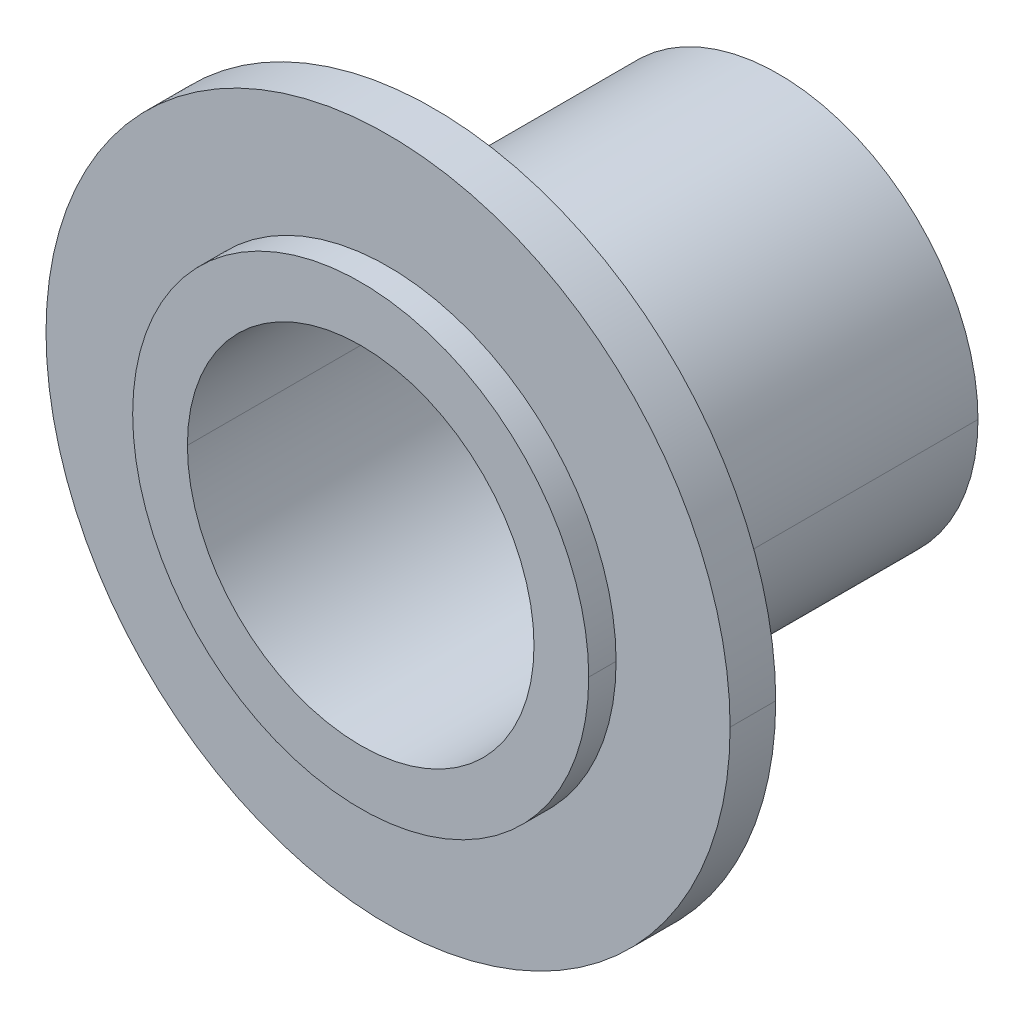
ISO-10303-21;
HEADER;
FILE_DESCRIPTION(('STEP AP214'),'2;1');
FILE_NAME('part.step','',(''),(''),'','','');
FILE_SCHEMA(('AUTOMOTIVE_DESIGN { 1 0 10303 214 1 1 1 1 }'));
ENDSEC;
DATA;
#1=APPLICATION_CONTEXT('core data for automotive mechanical design processes');
#2=APPLICATION_PROTOCOL_DEFINITION('international standard','automotive_design',2000,#1);
#3=PRODUCT_CONTEXT('',#1,'mechanical');
#4=PRODUCT('Part','Part','',(#3));
#5=PRODUCT_RELATED_PRODUCT_CATEGORY('part','',(#4));
#6=PRODUCT_DEFINITION_FORMATION('','',#4);
#7=PRODUCT_DEFINITION_CONTEXT('part definition',#1,'design');
#8=PRODUCT_DEFINITION('design','',#6,#7);
#9=PRODUCT_DEFINITION_SHAPE('','',#8);
#10=(LENGTH_UNIT() NAMED_UNIT(*) SI_UNIT(.MILLI.,.METRE.));
#11=(NAMED_UNIT(*) PLANE_ANGLE_UNIT() SI_UNIT($,.RADIAN.));
#12=(NAMED_UNIT(*) SI_UNIT($,.STERADIAN.) SOLID_ANGLE_UNIT());
#13=UNCERTAINTY_MEASURE_WITH_UNIT(LENGTH_MEASURE(1.E-05),#10,'distance_accuracy_value','');
#14=(GEOMETRIC_REPRESENTATION_CONTEXT(3) GLOBAL_UNCERTAINTY_ASSIGNED_CONTEXT((#13)) GLOBAL_UNIT_ASSIGNED_CONTEXT((#10,
#11,#12)) REPRESENTATION_CONTEXT('',''));
#15=CARTESIAN_POINT('',(0.,0.,0.));
#16=DIRECTION('',(0.,0.,1.));
#17=DIRECTION('',(1.,0.,0.));
#18=AXIS2_PLACEMENT_3D('',#15,#16,#17);
#19=CARTESIAN_POINT('',(0.,0.,-10.2362));
#20=DIRECTION('',(0.,0.,1.));
#21=DIRECTION('',(1.,0.,0.));
#22=AXIS2_PLACEMENT_3D('',#19,#20,#21);
#23=CYLINDRICAL_SURFACE('',#22,5.55625);
#24=DIRECTION('',(0.,0.,1.));
#25=VECTOR('',#24,1.);
#26=CARTESIAN_POINT('',(-5.55625,0.,-10.2362));
#27=LINE('',#26,#25);
#28=CARTESIAN_POINT('',(-5.55625,0.,-10.2362));
#29=VERTEX_POINT('',#28);
#30=CARTESIAN_POINT('',(-5.55625,0.,-0.635));
#31=VERTEX_POINT('',#30);
#32=EDGE_CURVE('E162',#29,#31,#27,.T.);
#33=ORIENTED_EDGE('',*,*,#32,.F.);
#34=CARTESIAN_POINT('',(0.,0.,-10.2362));
#35=DIRECTION('',(0.,0.,-1.));
#36=DIRECTION('',(-1.,0.,0.));
#37=AXIS2_PLACEMENT_3D('',#34,#35,#36);
#38=CIRCLE('',#37,5.55625);
#39=CARTESIAN_POINT('',(5.55625,0.,-10.2362));
#40=VERTEX_POINT('',#39);
#41=EDGE_CURVE('E11',#40,#29,#38,.T.);
#42=ORIENTED_EDGE('',*,*,#41,.F.);
#43=DIRECTION('',(0.,0.,1.));
#44=VECTOR('',#43,1.);
#45=CARTESIAN_POINT('',(5.55625,0.,-10.2362));
#46=LINE('',#45,#44);
#47=CARTESIAN_POINT('',(5.55625,0.,-0.635));
#48=VERTEX_POINT('',#47);
#49=EDGE_CURVE('E157',#40,#48,#46,.T.);
#50=ORIENTED_EDGE('',*,*,#49,.T.);
#51=CARTESIAN_POINT('',(0.,0.,-0.635));
#52=DIRECTION('',(0.,0.,-1.));
#53=DIRECTION('',(1.,0.,0.));
#54=AXIS2_PLACEMENT_3D('',#51,#52,#53);
#55=CIRCLE('',#54,5.55625);
#56=EDGE_CURVE('E150',#48,#31,#55,.T.);
#57=ORIENTED_EDGE('',*,*,#56,.T.);
#58=EDGE_LOOP('',(#33,#42,#50,#57));
#59=FACE_BOUND('',#58,.T.);
#60=ADVANCED_FACE('F16',(#59),#23,.T.);
#61=CARTESIAN_POINT('',(0.,0.,-10.2362));
#62=DIRECTION('',(0.,0.,-1.));
#63=DIRECTION('',(0.,-1.,0.));
#64=AXIS2_PLACEMENT_3D('',#61,#62,#63);
#65=PLANE('',#64);
#66=CARTESIAN_POINT('',(0.,0.,-10.2362));
#67=DIRECTION('',(0.,0.,-1.));
#68=DIRECTION('',(-1.,0.,0.));
#69=AXIS2_PLACEMENT_3D('',#66,#67,#68);
#70=CIRCLE('',#69,4.826);
#71=CARTESIAN_POINT('',(-4.826,0.,-10.2362));
#72=VERTEX_POINT('',#71);
#73=CARTESIAN_POINT('',(4.826,0.,-10.2362));
#74=VERTEX_POINT('',#73);
#75=EDGE_CURVE('E20',#72,#74,#70,.T.);
#76=ORIENTED_EDGE('',*,*,#75,.F.);
#77=CARTESIAN_POINT('',(0.,0.,-10.2362));
#78=DIRECTION('',(0.,0.,-1.));
#79=DIRECTION('',(-1.,0.,0.));
#80=AXIS2_PLACEMENT_3D('',#77,#78,#79);
#81=CIRCLE('',#80,4.826);
#82=EDGE_CURVE('E105',#74,#72,#81,.T.);
#83=ORIENTED_EDGE('',*,*,#82,.F.);
#84=EDGE_LOOP('',(#76,#83));
#85=FACE_BOUND('',#84,.T.);
#86=ORIENTED_EDGE('',*,*,#41,.T.);
#87=CARTESIAN_POINT('',(0.,0.,-10.2362));
#88=DIRECTION('',(0.,0.,-1.));
#89=DIRECTION('',(-1.,0.,0.));
#90=AXIS2_PLACEMENT_3D('',#87,#88,#89);
#91=CIRCLE('',#90,5.55625);
#92=EDGE_CURVE('E158',#29,#40,#91,.T.);
#93=ORIENTED_EDGE('',*,*,#92,.T.);
#94=EDGE_LOOP('',(#86,#93));
#95=FACE_BOUND('',#94,.T.);
#96=ADVANCED_FACE('F102',(#85,#95),#65,.T.);
#97=CARTESIAN_POINT('',(0.,0.,1.397));
#98=DIRECTION('',(0.,0.,-1.));
#99=DIRECTION('',(-1.,0.,0.));
#100=AXIS2_PLACEMENT_3D('',#97,#98,#99);
#101=CYLINDRICAL_SURFACE('',#100,6.35);
#102=DIRECTION('',(0.,0.,-1.));
#103=VECTOR('',#102,1.);
#104=CARTESIAN_POINT('',(6.35,0.,1.397));
#105=LINE('',#104,#103);
#106=CARTESIAN_POINT('',(6.35,0.,1.397));
#107=VERTEX_POINT('',#106);
#108=CARTESIAN_POINT('',(6.35,0.,0.635));
#109=VERTEX_POINT('',#108);
#110=EDGE_CURVE('E156',#107,#109,#105,.T.);
#111=ORIENTED_EDGE('',*,*,#110,.F.);
#112=CARTESIAN_POINT('',(0.,0.,1.397));
#113=DIRECTION('',(0.,0.,1.));
#114=DIRECTION('',(1.,0.,0.));
#115=AXIS2_PLACEMENT_3D('',#112,#113,#114);
#116=CIRCLE('',#115,6.35);
#117=CARTESIAN_POINT('',(-6.35,0.,1.397));
#118=VERTEX_POINT('',#117);
#119=EDGE_CURVE('E27',#118,#107,#116,.T.);
#120=ORIENTED_EDGE('',*,*,#119,.F.);
#121=DIRECTION('',(0.,0.,-1.));
#122=VECTOR('',#121,1.);
#123=CARTESIAN_POINT('',(-6.35,0.,1.397));
#124=LINE('',#123,#122);
#125=CARTESIAN_POINT('',(-6.35,0.,0.635));
#126=VERTEX_POINT('',#125);
#127=EDGE_CURVE('E143',#118,#126,#124,.T.);
#128=ORIENTED_EDGE('',*,*,#127,.T.);
#129=CARTESIAN_POINT('',(0.,0.,0.635));
#130=DIRECTION('',(0.,0.,1.));
#131=DIRECTION('',(1.,0.,0.));
#132=AXIS2_PLACEMENT_3D('',#129,#130,#131);
#133=CIRCLE('',#132,6.35);
#134=EDGE_CURVE('E149',#126,#109,#133,.T.);
#135=ORIENTED_EDGE('',*,*,#134,.T.);
#136=EDGE_LOOP('',(#111,#120,#128,#135));
#137=FACE_BOUND('',#136,.T.);
#138=ADVANCED_FACE('F306',(#137),#101,.T.);
#139=CARTESIAN_POINT('',(0.,0.,1.397));
#140=DIRECTION('',(0.,0.,1.));
#141=DIRECTION('',(1.,0.,0.));
#142=AXIS2_PLACEMENT_3D('',#139,#140,#141);
#143=PLANE('',#142);
#144=CARTESIAN_POINT('',(0.,0.,1.397));
#145=DIRECTION('',(0.,0.,1.));
#146=DIRECTION('',(1.,0.,0.));
#147=AXIS2_PLACEMENT_3D('',#144,#145,#146);
#148=CIRCLE('',#147,4.826);
#149=CARTESIAN_POINT('',(-4.826,0.,1.397));
#150=VERTEX_POINT('',#149);
#151=CARTESIAN_POINT('',(4.826,0.,1.397));
#152=VERTEX_POINT('',#151);
#153=EDGE_CURVE('E127',#150,#152,#148,.T.);
#154=ORIENTED_EDGE('',*,*,#153,.F.);
#155=CARTESIAN_POINT('',(0.,0.,1.397));
#156=DIRECTION('',(0.,0.,1.));
#157=DIRECTION('',(1.,0.,0.));
#158=AXIS2_PLACEMENT_3D('',#155,#156,#157);
#159=CIRCLE('',#158,4.826);
#160=EDGE_CURVE('E108',#152,#150,#159,.T.);
#161=ORIENTED_EDGE('',*,*,#160,.F.);
#162=EDGE_LOOP('',(#154,#161));
#163=FACE_BOUND('',#162,.T.);
#164=ORIENTED_EDGE('',*,*,#119,.T.);
#165=CARTESIAN_POINT('',(0.,0.,1.397));
#166=DIRECTION('',(0.,0.,1.));
#167=DIRECTION('',(1.,0.,0.));
#168=AXIS2_PLACEMENT_3D('',#165,#166,#167);
#169=CIRCLE('',#168,6.35);
#170=EDGE_CURVE('E152',#107,#118,#169,.T.);
#171=ORIENTED_EDGE('',*,*,#170,.T.);
#172=EDGE_LOOP('',(#164,#171));
#173=FACE_BOUND('',#172,.T.);
#174=ADVANCED_FACE('F298',(#163,#173),#143,.T.);
#175=CARTESIAN_POINT('',(0.,0.,0.635));
#176=DIRECTION('',(0.,0.,-1.));
#177=DIRECTION('',(-1.,0.,0.));
#178=AXIS2_PLACEMENT_3D('',#175,#176,#177);
#179=CYLINDRICAL_SURFACE('',#178,4.826);
#180=DIRECTION('',(0.,0.,-1.));
#181=VECTOR('',#180,1.);
#182=CARTESIAN_POINT('',(4.826,0.,0.635));
#183=LINE('',#182,#181);
#184=EDGE_CURVE('E119',#152,#74,#183,.T.);
#185=ORIENTED_EDGE('',*,*,#184,.F.);
#186=ORIENTED_EDGE('',*,*,#160,.T.);
#187=DIRECTION('',(0.,0.,-1.));
#188=VECTOR('',#187,1.);
#189=CARTESIAN_POINT('',(-4.826,0.,0.635));
#190=LINE('',#189,#188);
#191=EDGE_CURVE('E110',#150,#72,#190,.T.);
#192=ORIENTED_EDGE('',*,*,#191,.T.);
#193=ORIENTED_EDGE('',*,*,#75,.T.);
#194=EDGE_LOOP('',(#185,#186,#192,#193));
#195=FACE_BOUND('',#194,.T.);
#196=ADVANCED_FACE('F111',(#195),#179,.F.);
#197=CARTESIAN_POINT('',(0.,0.,0.635));
#198=DIRECTION('',(0.,0.,-1.));
#199=DIRECTION('',(-1.,0.,0.));
#200=AXIS2_PLACEMENT_3D('',#197,#198,#199);
#201=CYLINDRICAL_SURFACE('',#200,9.525);
#202=DIRECTION('',(0.,0.,-1.));
#203=VECTOR('',#202,1.);
#204=CARTESIAN_POINT('',(9.525,0.,0.635));
#205=LINE('',#204,#203);
#206=CARTESIAN_POINT('',(9.525,0.,0.635));
#207=VERTEX_POINT('',#206);
#208=CARTESIAN_POINT('',(9.525,0.,-0.635));
#209=VERTEX_POINT('',#208);
#210=EDGE_CURVE('E137',#207,#209,#205,.T.);
#211=ORIENTED_EDGE('',*,*,#210,.F.);
#212=CARTESIAN_POINT('',(0.,0.,0.635));
#213=DIRECTION('',(0.,0.,1.));
#214=DIRECTION('',(1.,0.,0.));
#215=AXIS2_PLACEMENT_3D('',#212,#213,#214);
#216=CIRCLE('',#215,9.525);
#217=CARTESIAN_POINT('',(-9.525,0.,0.635));
#218=VERTEX_POINT('',#217);
#219=EDGE_CURVE('E147',#218,#207,#216,.T.);
#220=ORIENTED_EDGE('',*,*,#219,.F.);
#221=DIRECTION('',(0.,0.,-1.));
#222=VECTOR('',#221,1.);
#223=CARTESIAN_POINT('',(-9.525,0.,0.635));
#224=LINE('',#223,#222);
#225=CARTESIAN_POINT('',(-9.525,0.,-0.635));
#226=VERTEX_POINT('',#225);
#227=EDGE_CURVE('E136',#218,#226,#224,.T.);
#228=ORIENTED_EDGE('',*,*,#227,.T.);
#229=CARTESIAN_POINT('',(0.,0.,-0.635));
#230=DIRECTION('',(0.,0.,1.));
#231=DIRECTION('',(1.,0.,0.));
#232=AXIS2_PLACEMENT_3D('',#229,#230,#231);
#233=CIRCLE('',#232,9.525);
#234=EDGE_CURVE('E41',#226,#209,#233,.T.);
#235=ORIENTED_EDGE('',*,*,#234,.T.);
#236=EDGE_LOOP('',(#211,#220,#228,#235));
#237=FACE_BOUND('',#236,.T.);
#238=ADVANCED_FACE('F286',(#237),#201,.T.);
#239=CARTESIAN_POINT('',(0.,0.,0.635));
#240=DIRECTION('',(0.,0.,1.));
#241=DIRECTION('',(1.,0.,0.));
#242=AXIS2_PLACEMENT_3D('',#239,#240,#241);
#243=PLANE('',#242);
#244=ORIENTED_EDGE('',*,*,#134,.F.);
#245=CARTESIAN_POINT('',(0.,0.,0.635));
#246=DIRECTION('',(0.,0.,1.));
#247=DIRECTION('',(1.,0.,0.));
#248=AXIS2_PLACEMENT_3D('',#245,#246,#247);
#249=CIRCLE('',#248,6.35);
#250=EDGE_CURVE('E131',#109,#126,#249,.T.);
#251=ORIENTED_EDGE('',*,*,#250,.F.);
#252=EDGE_LOOP('',(#244,#251));
#253=FACE_BOUND('',#252,.T.);
#254=ORIENTED_EDGE('',*,*,#219,.T.);
#255=CARTESIAN_POINT('',(0.,0.,0.635));
#256=DIRECTION('',(0.,0.,1.));
#257=DIRECTION('',(1.,0.,0.));
#258=AXIS2_PLACEMENT_3D('',#255,#256,#257);
#259=CIRCLE('',#258,9.525);
#260=EDGE_CURVE('E116',#207,#218,#259,.T.);
#261=ORIENTED_EDGE('',*,*,#260,.T.);
#262=EDGE_LOOP('',(#254,#261));
#263=FACE_BOUND('',#262,.T.);
#264=ADVANCED_FACE('F18',(#253,#263),#243,.T.);
#265=CARTESIAN_POINT('',(0.,0.,-0.635));
#266=DIRECTION('',(0.,0.,1.));
#267=DIRECTION('',(1.,0.,0.));
#268=AXIS2_PLACEMENT_3D('',#265,#266,#267);
#269=PLANE('',#268);
#270=ORIENTED_EDGE('',*,*,#56,.F.);
#271=CARTESIAN_POINT('',(0.,0.,-0.635));
#272=DIRECTION('',(0.,0.,-1.));
#273=DIRECTION('',(1.,0.,0.));
#274=AXIS2_PLACEMENT_3D('',#271,#272,#273);
#275=CIRCLE('',#274,5.55625);
#276=EDGE_CURVE('E175',#31,#48,#275,.T.);
#277=ORIENTED_EDGE('',*,*,#276,.F.);
#278=EDGE_LOOP('',(#270,#277));
#279=FACE_BOUND('',#278,.T.);
#280=ORIENTED_EDGE('',*,*,#234,.F.);
#281=CARTESIAN_POINT('',(0.,0.,-0.635));
#282=DIRECTION('',(0.,0.,1.));
#283=DIRECTION('',(1.,0.,0.));
#284=AXIS2_PLACEMENT_3D('',#281,#282,#283);
#285=CIRCLE('',#284,9.525);
#286=EDGE_CURVE('E133',#209,#226,#285,.T.);
#287=ORIENTED_EDGE('',*,*,#286,.F.);
#288=EDGE_LOOP('',(#280,#287));
#289=FACE_BOUND('',#288,.T.);
#290=ADVANCED_FACE('F280',(#279,#289),#269,.F.);
#291=CARTESIAN_POINT('',(0.,0.,0.635));
#292=DIRECTION('',(0.,0.,-1.));
#293=DIRECTION('',(-1.,0.,0.));
#294=AXIS2_PLACEMENT_3D('',#291,#292,#293);
#295=CYLINDRICAL_SURFACE('',#294,9.525);
#296=ORIENTED_EDGE('',*,*,#260,.F.);
#297=ORIENTED_EDGE('',*,*,#210,.T.);
#298=ORIENTED_EDGE('',*,*,#286,.T.);
#299=ORIENTED_EDGE('',*,*,#227,.F.);
#300=EDGE_LOOP('',(#296,#297,#298,#299));
#301=FACE_BOUND('',#300,.T.);
#302=ADVANCED_FACE('F276',(#301),#295,.T.);
#303=CARTESIAN_POINT('',(0.,0.,0.635));
#304=DIRECTION('',(0.,0.,-1.));
#305=DIRECTION('',(-1.,0.,0.));
#306=AXIS2_PLACEMENT_3D('',#303,#304,#305);
#307=CYLINDRICAL_SURFACE('',#306,4.826);
#308=ORIENTED_EDGE('',*,*,#153,.T.);
#309=ORIENTED_EDGE('',*,*,#184,.T.);
#310=ORIENTED_EDGE('',*,*,#82,.T.);
#311=ORIENTED_EDGE('',*,*,#191,.F.);
#312=EDGE_LOOP('',(#308,#309,#310,#311));
#313=FACE_BOUND('',#312,.T.);
#314=ADVANCED_FACE('F118',(#313),#307,.F.);
#315=CARTESIAN_POINT('',(0.,0.,1.397));
#316=DIRECTION('',(0.,0.,-1.));
#317=DIRECTION('',(-1.,0.,0.));
#318=AXIS2_PLACEMENT_3D('',#315,#316,#317);
#319=CYLINDRICAL_SURFACE('',#318,6.35);
#320=ORIENTED_EDGE('',*,*,#170,.F.);
#321=ORIENTED_EDGE('',*,*,#110,.T.);
#322=ORIENTED_EDGE('',*,*,#250,.T.);
#323=ORIENTED_EDGE('',*,*,#127,.F.);
#324=EDGE_LOOP('',(#320,#321,#322,#323));
#325=FACE_BOUND('',#324,.T.);
#326=ADVANCED_FACE('F266',(#325),#319,.T.);
#327=CARTESIAN_POINT('',(0.,0.,-10.2362));
#328=DIRECTION('',(0.,0.,1.));
#329=DIRECTION('',(1.,0.,0.));
#330=AXIS2_PLACEMENT_3D('',#327,#328,#329);
#331=CYLINDRICAL_SURFACE('',#330,5.55625);
#332=ORIENTED_EDGE('',*,*,#92,.F.);
#333=ORIENTED_EDGE('',*,*,#32,.T.);
#334=ORIENTED_EDGE('',*,*,#276,.T.);
#335=ORIENTED_EDGE('',*,*,#49,.F.);
#336=EDGE_LOOP('',(#332,#333,#334,#335));
#337=FACE_BOUND('',#336,.T.);
#338=ADVANCED_FACE('F270',(#337),#331,.T.);
#339=CLOSED_SHELL('',(#60,#96,#138,#174,#196,#238,#264,#290,#302,#314,#326,#338));
#340=MANIFOLD_SOLID_BREP('B1',#339);
#341=ADVANCED_BREP_SHAPE_REPRESENTATION('',(#18,#340),#14);
#342=SHAPE_DEFINITION_REPRESENTATION(#9,#341);
ENDSEC;
END-ISO-10303-21;
